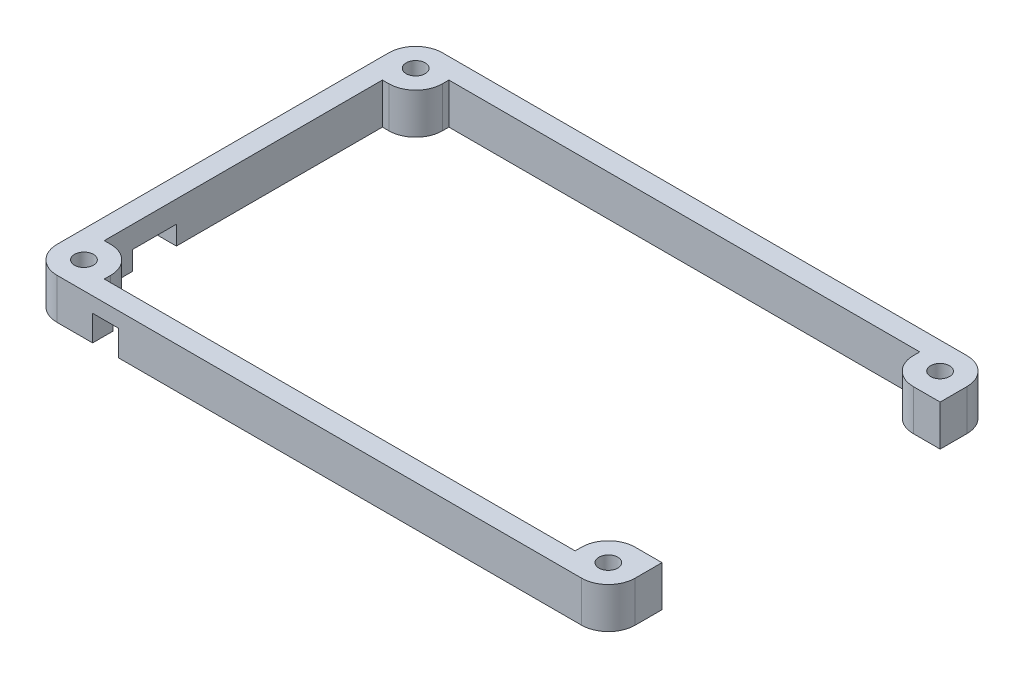
ISO-10303-21;
HEADER;
FILE_DESCRIPTION(('STEP AP214'),'2;1');
FILE_NAME('part.step','',(''),(''),'','','');
FILE_SCHEMA(('AUTOMOTIVE_DESIGN { 1 0 10303 214 1 1 1 1 }'));
ENDSEC;
DATA;
#1=APPLICATION_CONTEXT('core data for automotive mechanical design processes');
#2=APPLICATION_PROTOCOL_DEFINITION('international standard','automotive_design',2000,#1);
#3=PRODUCT_CONTEXT('',#1,'mechanical');
#4=PRODUCT('Part','Part','',(#3));
#5=PRODUCT_RELATED_PRODUCT_CATEGORY('part','',(#4));
#6=PRODUCT_DEFINITION_FORMATION('','',#4);
#7=PRODUCT_DEFINITION_CONTEXT('part definition',#1,'design');
#8=PRODUCT_DEFINITION('design','',#6,#7);
#9=PRODUCT_DEFINITION_SHAPE('','',#8);
#10=(LENGTH_UNIT() NAMED_UNIT(*) SI_UNIT(.MILLI.,.METRE.));
#11=(NAMED_UNIT(*) PLANE_ANGLE_UNIT() SI_UNIT($,.RADIAN.));
#12=(NAMED_UNIT(*) SI_UNIT($,.STERADIAN.) SOLID_ANGLE_UNIT());
#13=UNCERTAINTY_MEASURE_WITH_UNIT(LENGTH_MEASURE(1.E-05),#10,'distance_accuracy_value','');
#14=(GEOMETRIC_REPRESENTATION_CONTEXT(3) GLOBAL_UNCERTAINTY_ASSIGNED_CONTEXT((#13)) GLOBAL_UNIT_ASSIGNED_CONTEXT((#10,
#11,#12)) REPRESENTATION_CONTEXT('',''));
#15=CARTESIAN_POINT('',(0.,0.,0.));
#16=DIRECTION('',(0.,0.,1.));
#17=DIRECTION('',(1.,0.,0.));
#18=AXIS2_PLACEMENT_3D('',#15,#16,#17);
#19=CARTESIAN_POINT('',(-40.825,0.,-25.825));
#20=DIRECTION('',(0.,1.,0.));
#21=DIRECTION('',(0.,0.,1.));
#22=AXIS2_PLACEMENT_3D('',#19,#20,#21);
#23=PLANE('',#22);
#24=CARTESIAN_POINT('',(-40.825,0.,25.8135633602308));
#25=DIRECTION('',(0.,-1.,0.));
#26=DIRECTION('',(0.,0.,-1.));
#27=AXIS2_PLACEMENT_3D('',#24,#25,#26);
#28=CIRCLE('',#27,1.4732);
#29=CARTESIAN_POINT('',(-40.825,0.,24.3403633602308));
#30=VERTEX_POINT('',#29);
#31=EDGE_CURVE('E352',#30,#30,#28,.T.);
#32=ORIENTED_EDGE('',*,*,#31,.F.);
#33=EDGE_LOOP('',(#32));
#34=FACE_BOUND('',#33,.T.);
#35=DIRECTION('',(1.,0.,0.));
#36=VECTOR('',#35,1.);
#37=CARTESIAN_POINT('',(-36.65,0.,26.825));
#38=LINE('',#37,#36);
#39=CARTESIAN_POINT('',(-36.65,0.,26.825));
#40=VERTEX_POINT('',#39);
#41=CARTESIAN_POINT('',(-35.2866,0.,26.825));
#42=VERTEX_POINT('',#41);
#43=EDGE_CURVE('E261',#40,#42,#38,.T.);
#44=ORIENTED_EDGE('',*,*,#43,.T.);
#45=DIRECTION('',(0.,0.,1.));
#46=VECTOR('',#45,1.);
#47=CARTESIAN_POINT('',(-35.2866,0.,26.));
#48=LINE('',#47,#46);
#49=CARTESIAN_POINT('',(-35.2866,0.,30.));
#50=VERTEX_POINT('',#49);
#51=EDGE_CURVE('E244',#42,#50,#48,.T.);
#52=ORIENTED_EDGE('',*,*,#51,.T.);
#53=DIRECTION('',(1.,0.,0.));
#54=VECTOR('',#53,1.);
#55=CARTESIAN_POINT('',(-40.825,0.,30.));
#56=LINE('',#55,#54);
#57=CARTESIAN_POINT('',(-40.825,0.,30.));
#58=VERTEX_POINT('',#57);
#59=EDGE_CURVE('E258',#58,#50,#56,.T.);
#60=ORIENTED_EDGE('',*,*,#59,.F.);
#61=CARTESIAN_POINT('',(-40.825,0.,25.825));
#62=DIRECTION('',(0.,1.,0.));
#63=DIRECTION('',(0.,0.,1.));
#64=AXIS2_PLACEMENT_3D('',#61,#62,#63);
#65=CIRCLE('',#64,4.17500000000001);
#66=CARTESIAN_POINT('',(-45.,0.,25.825));
#67=VERTEX_POINT('',#66);
#68=EDGE_CURVE('E275',#67,#58,#65,.T.);
#69=ORIENTED_EDGE('',*,*,#68,.F.);
#70=DIRECTION('',(0.,0.,1.));
#71=VECTOR('',#70,1.);
#72=CARTESIAN_POINT('',(-45.,0.,-25.825));
#73=LINE('',#72,#71);
#74=CARTESIAN_POINT('',(-45.,0.,17.225));
#75=VERTEX_POINT('',#74);
#76=EDGE_CURVE('E506',#75,#67,#73,.T.);
#77=ORIENTED_EDGE('',*,*,#76,.F.);
#78=DIRECTION('',(1.,0.,0.));
#79=VECTOR('',#78,1.);
#80=CARTESIAN_POINT('',(-40.825,0.,17.225));
#81=LINE('',#80,#79);
#82=CARTESIAN_POINT('',(-41.825,0.,17.225));
#83=VERTEX_POINT('',#82);
#84=EDGE_CURVE('E382',#75,#83,#81,.T.);
#85=ORIENTED_EDGE('',*,*,#84,.T.);
#86=DIRECTION('',(0.,0.,1.));
#87=VECTOR('',#86,1.);
#88=CARTESIAN_POINT('',(-41.825,0.,-21.65));
#89=LINE('',#88,#87);
#90=CARTESIAN_POINT('',(-41.825,0.,21.65));
#91=VERTEX_POINT('',#90);
#92=EDGE_CURVE('E435',#83,#91,#89,.T.);
#93=ORIENTED_EDGE('',*,*,#92,.T.);
#94=DIRECTION('',(1.,0.,0.));
#95=VECTOR('',#94,1.);
#96=CARTESIAN_POINT('',(-40.825,0.,21.65));
#97=LINE('',#96,#95);
#98=CARTESIAN_POINT('',(-40.825,0.,21.65));
#99=VERTEX_POINT('',#98);
#100=EDGE_CURVE('E439',#91,#99,#97,.T.);
#101=ORIENTED_EDGE('',*,*,#100,.T.);
#102=CARTESIAN_POINT('',(-40.825,0.,25.825));
#103=DIRECTION('',(0.,-1.,0.));
#104=DIRECTION('',(0.,0.,1.));
#105=AXIS2_PLACEMENT_3D('',#102,#103,#104);
#106=CIRCLE('',#105,4.17499999999999);
#107=CARTESIAN_POINT('',(-36.65,0.,25.825));
#108=VERTEX_POINT('',#107);
#109=EDGE_CURVE('E442',#99,#108,#106,.T.);
#110=ORIENTED_EDGE('',*,*,#109,.T.);
#111=DIRECTION('',(0.,0.,1.));
#112=VECTOR('',#111,1.);
#113=CARTESIAN_POINT('',(-36.65,0.,25.825));
#114=LINE('',#113,#112);
#115=EDGE_CURVE('E445',#108,#40,#114,.T.);
#116=ORIENTED_EDGE('',*,*,#115,.T.);
#117=EDGE_LOOP('',(#44,#52,#60,#69,#77,#85,#93,#101,#110,#116));
#118=FACE_BOUND('',#117,.T.);
#119=ADVANCED_FACE('F34',(#34,#118),#23,.F.);
#120=CARTESIAN_POINT('',(-40.825,0.,-25.825));
#121=DIRECTION('',(0.,-1.,0.));
#122=DIRECTION('',(0.,0.,-1.));
#123=AXIS2_PLACEMENT_3D('',#120,#121,#122);
#124=CIRCLE('',#123,1.475);
#125=CARTESIAN_POINT('',(-40.825,0.,-27.3));
#126=VERTEX_POINT('',#125);
#127=EDGE_CURVE('E358',#126,#126,#124,.T.);
#128=ORIENTED_EDGE('',*,*,#127,.F.);
#129=EDGE_LOOP('',(#128));
#130=FACE_BOUND('',#129,.T.);
#131=CARTESIAN_POINT('',(40.825,0.,-25.8148796301043));
#132=DIRECTION('',(0.,-1.,0.));
#133=DIRECTION('',(0.,0.,-1.));
#134=AXIS2_PLACEMENT_3D('',#131,#132,#133);
#135=CIRCLE('',#134,1.4732);
#136=CARTESIAN_POINT('',(40.825,0.,-27.2880796301043));
#137=VERTEX_POINT('',#136);
#138=EDGE_CURVE('E337',#137,#137,#135,.T.);
#139=ORIENTED_EDGE('',*,*,#138,.F.);
#140=EDGE_LOOP('',(#139));
#141=FACE_BOUND('',#140,.T.);
#142=DIRECTION('',(0.,0.,-1.));
#143=VECTOR('',#142,1.);
#144=CARTESIAN_POINT('',(45.,0.,-25.825));
#145=LINE('',#144,#143);
#146=CARTESIAN_POINT('',(45.,0.,-21.65));
#147=VERTEX_POINT('',#146);
#148=CARTESIAN_POINT('',(45.,0.,-25.825));
#149=VERTEX_POINT('',#148);
#150=EDGE_CURVE('E273',#147,#149,#145,.T.);
#151=ORIENTED_EDGE('',*,*,#150,.F.);
#152=DIRECTION('',(-1.,0.,0.));
#153=VECTOR('',#152,1.);
#154=CARTESIAN_POINT('',(40.825,0.,-21.65));
#155=LINE('',#154,#153);
#156=CARTESIAN_POINT('',(40.825,0.,-21.65));
#157=VERTEX_POINT('',#156);
#158=EDGE_CURVE('E389',#147,#157,#155,.T.);
#159=ORIENTED_EDGE('',*,*,#158,.T.);
#160=CARTESIAN_POINT('',(40.825,0.,-25.825));
#161=DIRECTION('',(0.,-1.,0.));
#162=DIRECTION('',(0.,0.,1.));
#163=AXIS2_PLACEMENT_3D('',#160,#161,#162);
#164=CIRCLE('',#163,4.175);
#165=CARTESIAN_POINT('',(36.65,0.,-25.825));
#166=VERTEX_POINT('',#165);
#167=EDGE_CURVE('E385',#157,#166,#164,.T.);
#168=ORIENTED_EDGE('',*,*,#167,.T.);
#169=DIRECTION('',(0.,0.,-1.));
#170=VECTOR('',#169,1.);
#171=CARTESIAN_POINT('',(36.65,0.,-25.825));
#172=LINE('',#171,#170);
#173=CARTESIAN_POINT('',(36.65,0.,-26.825));
#174=VERTEX_POINT('',#173);
#175=EDGE_CURVE('E420',#166,#174,#172,.T.);
#176=ORIENTED_EDGE('',*,*,#175,.T.);
#177=DIRECTION('',(-1.,0.,0.));
#178=VECTOR('',#177,1.);
#179=CARTESIAN_POINT('',(-36.65,0.,-26.825));
#180=LINE('',#179,#178);
#181=CARTESIAN_POINT('',(-36.65,0.,-26.825));
#182=VERTEX_POINT('',#181);
#183=EDGE_CURVE('E423',#174,#182,#180,.T.);
#184=ORIENTED_EDGE('',*,*,#183,.T.);
#185=DIRECTION('',(0.,0.,1.));
#186=VECTOR('',#185,1.);
#187=CARTESIAN_POINT('',(-36.65,0.,-25.825));
#188=LINE('',#187,#186);
#189=CARTESIAN_POINT('',(-36.65,0.,-25.825));
#190=VERTEX_POINT('',#189);
#191=EDGE_CURVE('E426',#182,#190,#188,.T.);
#192=ORIENTED_EDGE('',*,*,#191,.T.);
#193=CARTESIAN_POINT('',(-40.825,0.,-25.825));
#194=DIRECTION('',(0.,-1.,0.));
#195=DIRECTION('',(0.,0.,1.));
#196=AXIS2_PLACEMENT_3D('',#193,#194,#195);
#197=CIRCLE('',#196,4.175);
#198=CARTESIAN_POINT('',(-40.825,0.,-21.65));
#199=VERTEX_POINT('',#198);
#200=EDGE_CURVE('E429',#190,#199,#197,.T.);
#201=ORIENTED_EDGE('',*,*,#200,.T.);
#202=DIRECTION('',(-1.,0.,0.));
#203=VECTOR('',#202,1.);
#204=CARTESIAN_POINT('',(-40.825,0.,-21.65));
#205=LINE('',#204,#203);
#206=CARTESIAN_POINT('',(-41.825,0.,-21.65));
#207=VERTEX_POINT('',#206);
#208=EDGE_CURVE('E432',#199,#207,#205,.T.);
#209=ORIENTED_EDGE('',*,*,#208,.T.);
#210=CARTESIAN_POINT('',(-41.825,0.,10.425));
#211=VERTEX_POINT('',#210);
#212=EDGE_CURVE('E436',#207,#211,#89,.T.);
#213=ORIENTED_EDGE('',*,*,#212,.T.);
#214=DIRECTION('',(-1.,0.,0.));
#215=VECTOR('',#214,1.);
#216=CARTESIAN_POINT('',(-40.825,0.,10.425));
#217=LINE('',#216,#215);
#218=CARTESIAN_POINT('',(-45.,0.,10.425));
#219=VERTEX_POINT('',#218);
#220=EDGE_CURVE('E57',#211,#219,#217,.T.);
#221=ORIENTED_EDGE('',*,*,#220,.T.);
#222=CARTESIAN_POINT('',(-45.,0.,-25.825));
#223=VERTEX_POINT('',#222);
#224=EDGE_CURVE('E507',#223,#219,#73,.T.);
#225=ORIENTED_EDGE('',*,*,#224,.F.);
#226=CARTESIAN_POINT('',(-40.825,0.,-25.825));
#227=DIRECTION('',(0.,1.,0.));
#228=DIRECTION('',(0.,0.,1.));
#229=AXIS2_PLACEMENT_3D('',#226,#227,#228);
#230=CIRCLE('',#229,4.17499999999999);
#231=CARTESIAN_POINT('',(-40.825,0.,-30.));
#232=VERTEX_POINT('',#231);
#233=EDGE_CURVE('E487',#232,#223,#230,.T.);
#234=ORIENTED_EDGE('',*,*,#233,.F.);
#235=DIRECTION('',(-1.,0.,0.));
#236=VECTOR('',#235,1.);
#237=CARTESIAN_POINT('',(-40.825,0.,-30.));
#238=LINE('',#237,#236);
#239=CARTESIAN_POINT('',(40.825,0.,-30.));
#240=VERTEX_POINT('',#239);
#241=EDGE_CURVE('E284',#240,#232,#238,.T.);
#242=ORIENTED_EDGE('',*,*,#241,.F.);
#243=CARTESIAN_POINT('',(40.825,0.,-25.825));
#244=DIRECTION('',(0.,1.,0.));
#245=DIRECTION('',(0.,0.,1.));
#246=AXIS2_PLACEMENT_3D('',#243,#244,#245);
#247=CIRCLE('',#246,4.175);
#248=EDGE_CURVE('E282',#149,#240,#247,.T.);
#249=ORIENTED_EDGE('',*,*,#248,.F.);
#250=EDGE_LOOP('',(#151,#159,#168,#176,#184,#192,#201,#209,#213,#221,#225,#234,#242,#249));
#251=FACE_BOUND('',#250,.T.);
#252=ADVANCED_FACE('F531',(#130,#141,#251),#23,.F.);
#253=CARTESIAN_POINT('',(45.,6.35,-25.825));
#254=DIRECTION('',(-1.,0.,0.));
#255=DIRECTION('',(0.,0.,1.));
#256=AXIS2_PLACEMENT_3D('',#253,#254,#255);
#257=PLANE('',#256);
#258=DIRECTION('',(0.,0.,-1.));
#259=VECTOR('',#258,1.);
#260=CARTESIAN_POINT('',(45.,6.35,-25.825));
#261=LINE('',#260,#259);
#262=CARTESIAN_POINT('',(45.,6.35,-21.65));
#263=VERTEX_POINT('',#262);
#264=CARTESIAN_POINT('',(45.,6.35,-25.825));
#265=VERTEX_POINT('',#264);
#266=EDGE_CURVE('E498',#263,#265,#261,.T.);
#267=ORIENTED_EDGE('',*,*,#266,.F.);
#268=DIRECTION('',(0.,1.,0.));
#269=VECTOR('',#268,1.);
#270=CARTESIAN_POINT('',(45.,-3.65,-21.65));
#271=LINE('',#270,#269);
#272=EDGE_CURVE('E334',#147,#263,#271,.T.);
#273=ORIENTED_EDGE('',*,*,#272,.F.);
#274=ORIENTED_EDGE('',*,*,#150,.T.);
#275=DIRECTION('',(0.,-1.,0.));
#276=VECTOR('',#275,1.);
#277=CARTESIAN_POINT('',(45.,6.35,-25.825));
#278=LINE('',#277,#276);
#279=EDGE_CURVE('E294',#265,#149,#278,.T.);
#280=ORIENTED_EDGE('',*,*,#279,.F.);
#281=EDGE_LOOP('',(#267,#273,#274,#280));
#282=FACE_BOUND('',#281,.T.);
#283=ADVANCED_FACE('F599',(#282),#257,.F.);
#284=CARTESIAN_POINT('',(-40.825,6.35,-25.825));
#285=DIRECTION('',(0.,1.,0.));
#286=DIRECTION('',(0.,0.,1.));
#287=AXIS2_PLACEMENT_3D('',#284,#285,#286);
#288=PLANE('',#287);
#289=DIRECTION('',(-1.,0.,0.));
#290=VECTOR('',#289,1.);
#291=CARTESIAN_POINT('',(40.825,6.35,-21.65));
#292=LINE('',#291,#290);
#293=CARTESIAN_POINT('',(40.825,6.35,-21.65));
#294=VERTEX_POINT('',#293);
#295=EDGE_CURVE('E415',#263,#294,#292,.T.);
#296=ORIENTED_EDGE('',*,*,#295,.F.);
#297=ORIENTED_EDGE('',*,*,#266,.T.);
#298=CARTESIAN_POINT('',(40.825,6.35,-25.825));
#299=DIRECTION('',(0.,1.,0.));
#300=DIRECTION('',(0.,0.,1.));
#301=AXIS2_PLACEMENT_3D('',#298,#299,#300);
#302=CIRCLE('',#301,4.175);
#303=CARTESIAN_POINT('',(40.825,6.35,-30.));
#304=VERTEX_POINT('',#303);
#305=EDGE_CURVE('E502',#265,#304,#302,.T.);
#306=ORIENTED_EDGE('',*,*,#305,.T.);
#307=DIRECTION('',(-1.,0.,0.));
#308=VECTOR('',#307,1.);
#309=CARTESIAN_POINT('',(-40.825,6.35,-30.));
#310=LINE('',#309,#308);
#311=CARTESIAN_POINT('',(-40.825,6.35,-30.));
#312=VERTEX_POINT('',#311);
#313=EDGE_CURVE('E291',#304,#312,#310,.T.);
#314=ORIENTED_EDGE('',*,*,#313,.T.);
#315=CARTESIAN_POINT('',(-40.825,6.35,-25.825));
#316=DIRECTION('',(0.,1.,0.));
#317=DIRECTION('',(0.,0.,1.));
#318=AXIS2_PLACEMENT_3D('',#315,#316,#317);
#319=CIRCLE('',#318,4.17499999999999);
#320=CARTESIAN_POINT('',(-45.,6.35,-25.825));
#321=VERTEX_POINT('',#320);
#322=EDGE_CURVE('E286',#312,#321,#319,.T.);
#323=ORIENTED_EDGE('',*,*,#322,.T.);
#324=DIRECTION('',(0.,0.,1.));
#325=VECTOR('',#324,1.);
#326=CARTESIAN_POINT('',(-45.,6.35,-25.825));
#327=LINE('',#326,#325);
#328=CARTESIAN_POINT('',(-45.,6.35,25.825));
#329=VERTEX_POINT('',#328);
#330=EDGE_CURVE('E490',#321,#329,#327,.T.);
#331=ORIENTED_EDGE('',*,*,#330,.T.);
#332=CARTESIAN_POINT('',(-40.825,6.35,25.825));
#333=DIRECTION('',(0.,1.,0.));
#334=DIRECTION('',(0.,0.,1.));
#335=AXIS2_PLACEMENT_3D('',#332,#333,#334);
#336=CIRCLE('',#335,4.17500000000001);
#337=CARTESIAN_POINT('',(-40.825,6.35,30.));
#338=VERTEX_POINT('',#337);
#339=EDGE_CURVE('E492',#329,#338,#336,.T.);
#340=ORIENTED_EDGE('',*,*,#339,.T.);
#341=DIRECTION('',(1.,0.,0.));
#342=VECTOR('',#341,1.);
#343=CARTESIAN_POINT('',(-40.825,6.35,30.));
#344=LINE('',#343,#342);
#345=CARTESIAN_POINT('',(40.825,6.35,30.));
#346=VERTEX_POINT('',#345);
#347=EDGE_CURVE('E494',#338,#346,#344,.T.);
#348=ORIENTED_EDGE('',*,*,#347,.T.);
#349=CARTESIAN_POINT('',(40.825,6.35,25.825));
#350=DIRECTION('',(0.,1.,0.));
#351=DIRECTION('',(0.,0.,1.));
#352=AXIS2_PLACEMENT_3D('',#349,#350,#351);
#353=CIRCLE('',#352,4.17499999999999);
#354=CARTESIAN_POINT('',(45.,6.35,25.825));
#355=VERTEX_POINT('',#354);
#356=EDGE_CURVE('E496',#346,#355,#353,.T.);
#357=ORIENTED_EDGE('',*,*,#356,.T.);
#358=CARTESIAN_POINT('',(45.,6.35,21.65));
#359=VERTEX_POINT('',#358);
#360=EDGE_CURVE('E499',#355,#359,#261,.T.);
#361=ORIENTED_EDGE('',*,*,#360,.T.);
#362=DIRECTION('',(1.,0.,0.));
#363=VECTOR('',#362,1.);
#364=CARTESIAN_POINT('',(40.825,6.35,21.65));
#365=LINE('',#364,#363);
#366=CARTESIAN_POINT('',(40.825,6.35,21.65));
#367=VERTEX_POINT('',#366);
#368=EDGE_CURVE('E413',#367,#359,#365,.T.);
#369=ORIENTED_EDGE('',*,*,#368,.F.);
#370=CARTESIAN_POINT('',(40.825,6.35,25.825));
#371=DIRECTION('',(0.,-1.,0.));
#372=DIRECTION('',(0.,0.,1.));
#373=AXIS2_PLACEMENT_3D('',#370,#371,#372);
#374=CIRCLE('',#373,4.175);
#375=CARTESIAN_POINT('',(36.65,6.35,25.825));
#376=VERTEX_POINT('',#375);
#377=EDGE_CURVE('E411',#376,#367,#374,.T.);
#378=ORIENTED_EDGE('',*,*,#377,.F.);
#379=DIRECTION('',(0.,0.,-1.));
#380=VECTOR('',#379,1.);
#381=CARTESIAN_POINT('',(36.65,6.35,25.825));
#382=LINE('',#381,#380);
#383=CARTESIAN_POINT('',(36.65,6.35,26.825));
#384=VERTEX_POINT('',#383);
#385=EDGE_CURVE('E409',#384,#376,#382,.T.);
#386=ORIENTED_EDGE('',*,*,#385,.F.);
#387=DIRECTION('',(1.,0.,0.));
#388=VECTOR('',#387,1.);
#389=CARTESIAN_POINT('',(-36.65,6.35,26.825));
#390=LINE('',#389,#388);
#391=CARTESIAN_POINT('',(-36.65,6.35,26.825));
#392=VERTEX_POINT('',#391);
#393=EDGE_CURVE('E407',#392,#384,#390,.T.);
#394=ORIENTED_EDGE('',*,*,#393,.F.);
#395=DIRECTION('',(0.,0.,1.));
#396=VECTOR('',#395,1.);
#397=CARTESIAN_POINT('',(-36.65,6.35,25.825));
#398=LINE('',#397,#396);
#399=CARTESIAN_POINT('',(-36.65,6.35,25.825));
#400=VERTEX_POINT('',#399);
#401=EDGE_CURVE('E405',#400,#392,#398,.T.);
#402=ORIENTED_EDGE('',*,*,#401,.F.);
#403=CARTESIAN_POINT('',(-40.825,6.35,25.825));
#404=DIRECTION('',(0.,-1.,0.));
#405=DIRECTION('',(0.,0.,1.));
#406=AXIS2_PLACEMENT_3D('',#403,#404,#405);
#407=CIRCLE('',#406,4.17499999999999);
#408=CARTESIAN_POINT('',(-40.825,6.35,21.65));
#409=VERTEX_POINT('',#408);
#410=EDGE_CURVE('E403',#409,#400,#407,.T.);
#411=ORIENTED_EDGE('',*,*,#410,.F.);
#412=DIRECTION('',(1.,0.,0.));
#413=VECTOR('',#412,1.);
#414=CARTESIAN_POINT('',(-40.825,6.35,21.65));
#415=LINE('',#414,#413);
#416=CARTESIAN_POINT('',(-41.825,6.35,21.65));
#417=VERTEX_POINT('',#416);
#418=EDGE_CURVE('E401',#417,#409,#415,.T.);
#419=ORIENTED_EDGE('',*,*,#418,.F.);
#420=DIRECTION('',(0.,0.,1.));
#421=VECTOR('',#420,1.);
#422=CARTESIAN_POINT('',(-41.825,6.35,-21.65));
#423=LINE('',#422,#421);
#424=CARTESIAN_POINT('',(-41.825,6.35,-21.65));
#425=VERTEX_POINT('',#424);
#426=EDGE_CURVE('E399',#425,#417,#423,.T.);
#427=ORIENTED_EDGE('',*,*,#426,.F.);
#428=DIRECTION('',(-1.,0.,0.));
#429=VECTOR('',#428,1.);
#430=CARTESIAN_POINT('',(-40.825,6.35,-21.65));
#431=LINE('',#430,#429);
#432=CARTESIAN_POINT('',(-40.825,6.35,-21.65));
#433=VERTEX_POINT('',#432);
#434=EDGE_CURVE('E397',#433,#425,#431,.T.);
#435=ORIENTED_EDGE('',*,*,#434,.F.);
#436=CARTESIAN_POINT('',(-40.825,6.35,-25.825));
#437=DIRECTION('',(0.,-1.,0.));
#438=DIRECTION('',(0.,0.,1.));
#439=AXIS2_PLACEMENT_3D('',#436,#437,#438);
#440=CIRCLE('',#439,4.175);
#441=CARTESIAN_POINT('',(-36.65,6.35,-25.825));
#442=VERTEX_POINT('',#441);
#443=EDGE_CURVE('E395',#442,#433,#440,.T.);
#444=ORIENTED_EDGE('',*,*,#443,.F.);
#445=DIRECTION('',(0.,0.,1.));
#446=VECTOR('',#445,1.);
#447=CARTESIAN_POINT('',(-36.65,6.35,-25.825));
#448=LINE('',#447,#446);
#449=CARTESIAN_POINT('',(-36.65,6.35,-26.825));
#450=VERTEX_POINT('',#449);
#451=EDGE_CURVE('E393',#450,#442,#448,.T.);
#452=ORIENTED_EDGE('',*,*,#451,.F.);
#453=DIRECTION('',(-1.,0.,0.));
#454=VECTOR('',#453,1.);
#455=CARTESIAN_POINT('',(-36.65,6.35,-26.825));
#456=LINE('',#455,#454);
#457=CARTESIAN_POINT('',(36.65,6.35,-26.825));
#458=VERTEX_POINT('',#457);
#459=EDGE_CURVE('E391',#458,#450,#456,.T.);
#460=ORIENTED_EDGE('',*,*,#459,.F.);
#461=DIRECTION('',(0.,0.,-1.));
#462=VECTOR('',#461,1.);
#463=CARTESIAN_POINT('',(36.65,6.35,-25.825));
#464=LINE('',#463,#462);
#465=CARTESIAN_POINT('',(36.65,6.35,-25.825));
#466=VERTEX_POINT('',#465);
#467=EDGE_CURVE('E388',#466,#458,#464,.T.);
#468=ORIENTED_EDGE('',*,*,#467,.F.);
#469=CARTESIAN_POINT('',(40.825,6.35,-25.825));
#470=DIRECTION('',(0.,-1.,0.));
#471=DIRECTION('',(0.,0.,1.));
#472=AXIS2_PLACEMENT_3D('',#469,#470,#471);
#473=CIRCLE('',#472,4.175);
#474=EDGE_CURVE('E386',#294,#466,#473,.T.);
#475=ORIENTED_EDGE('',*,*,#474,.F.);
#476=EDGE_LOOP('',(#296,#297,#306,#314,#323,#331,#340,#348,#357,#361,#369,#378,#386,#394,#402,
#411,#419,#427,#435,#444,#452,#460,#468,#475));
#477=FACE_BOUND('',#476,.T.);
#478=CARTESIAN_POINT('',(40.825,6.35,-25.8148796301043));
#479=DIRECTION('',(0.,1.,0.));
#480=DIRECTION('',(0.,0.,1.));
#481=AXIS2_PLACEMENT_3D('',#478,#479,#480);
#482=CIRCLE('',#481,1.4732);
#483=CARTESIAN_POINT('',(40.825,6.35,-24.3416796301043));
#484=VERTEX_POINT('',#483);
#485=EDGE_CURVE('E343',#484,#484,#482,.F.);
#486=ORIENTED_EDGE('',*,*,#485,.T.);
#487=EDGE_LOOP('',(#486));
#488=FACE_BOUND('',#487,.T.);
#489=CARTESIAN_POINT('',(40.825,6.35,25.825));
#490=DIRECTION('',(0.,1.,0.));
#491=DIRECTION('',(0.,0.,1.));
#492=AXIS2_PLACEMENT_3D('',#489,#490,#491);
#493=CIRCLE('',#492,1.4732);
#494=CARTESIAN_POINT('',(40.825,6.35,27.2982));
#495=VERTEX_POINT('',#494);
#496=EDGE_CURVE('E349',#495,#495,#493,.F.);
#497=ORIENTED_EDGE('',*,*,#496,.T.);
#498=EDGE_LOOP('',(#497));
#499=FACE_BOUND('',#498,.T.);
#500=CARTESIAN_POINT('',(-40.825,6.35,25.8135633602308));
#501=DIRECTION('',(0.,1.,0.));
#502=DIRECTION('',(0.,0.,1.));
#503=AXIS2_PLACEMENT_3D('',#500,#501,#502);
#504=CIRCLE('',#503,1.4732);
#505=CARTESIAN_POINT('',(-40.825,6.35,27.2867633602308));
#506=VERTEX_POINT('',#505);
#507=EDGE_CURVE('E355',#506,#506,#504,.F.);
#508=ORIENTED_EDGE('',*,*,#507,.T.);
#509=EDGE_LOOP('',(#508));
#510=FACE_BOUND('',#509,.T.);
#511=CARTESIAN_POINT('',(-40.825,6.35,-25.825));
#512=DIRECTION('',(0.,1.,0.));
#513=DIRECTION('',(0.,0.,1.));
#514=AXIS2_PLACEMENT_3D('',#511,#512,#513);
#515=CIRCLE('',#514,1.475);
#516=CARTESIAN_POINT('',(-40.825,6.35,-24.35));
#517=VERTEX_POINT('',#516);
#518=EDGE_CURVE('E361',#517,#517,#515,.F.);
#519=ORIENTED_EDGE('',*,*,#518,.T.);
#520=EDGE_LOOP('',(#519));
#521=FACE_BOUND('',#520,.T.);
#522=ADVANCED_FACE('F520',(#477,#488,#499,#510,#521),#288,.T.);
#523=CARTESIAN_POINT('',(40.825,0.,25.825));
#524=DIRECTION('',(0.,-1.,0.));
#525=DIRECTION('',(0.,0.,-1.));
#526=AXIS2_PLACEMENT_3D('',#523,#524,#525);
#527=CIRCLE('',#526,1.4732);
#528=CARTESIAN_POINT('',(40.825,0.,24.3518));
#529=VERTEX_POINT('',#528);
#530=EDGE_CURVE('E346',#529,#529,#527,.T.);
#531=ORIENTED_EDGE('',*,*,#530,.F.);
#532=EDGE_LOOP('',(#531));
#533=FACE_BOUND('',#532,.T.);
#534=CARTESIAN_POINT('',(-31.2866,0.,30.));
#535=VERTEX_POINT('',#534);
#536=CARTESIAN_POINT('',(40.825,0.,30.));
#537=VERTEX_POINT('',#536);
#538=EDGE_CURVE('E271',#535,#537,#56,.T.);
#539=ORIENTED_EDGE('',*,*,#538,.F.);
#540=DIRECTION('',(0.,0.,1.));
#541=VECTOR('',#540,1.);
#542=CARTESIAN_POINT('',(-31.2866,0.,26.));
#543=LINE('',#542,#541);
#544=CARTESIAN_POINT('',(-31.2866,0.,26.825));
#545=VERTEX_POINT('',#544);
#546=EDGE_CURVE('E262',#545,#535,#543,.T.);
#547=ORIENTED_EDGE('',*,*,#546,.F.);
#548=CARTESIAN_POINT('',(36.65,0.,26.825));
#549=VERTEX_POINT('',#548);
#550=EDGE_CURVE('E321',#545,#549,#38,.T.);
#551=ORIENTED_EDGE('',*,*,#550,.T.);
#552=DIRECTION('',(0.,0.,-1.));
#553=VECTOR('',#552,1.);
#554=CARTESIAN_POINT('',(36.65,0.,25.825));
#555=LINE('',#554,#553);
#556=CARTESIAN_POINT('',(36.65,0.,25.825));
#557=VERTEX_POINT('',#556);
#558=EDGE_CURVE('E448',#549,#557,#555,.T.);
#559=ORIENTED_EDGE('',*,*,#558,.T.);
#560=CARTESIAN_POINT('',(40.825,0.,25.825));
#561=DIRECTION('',(0.,-1.,0.));
#562=DIRECTION('',(0.,0.,1.));
#563=AXIS2_PLACEMENT_3D('',#560,#561,#562);
#564=CIRCLE('',#563,4.175);
#565=CARTESIAN_POINT('',(40.825,0.,21.65));
#566=VERTEX_POINT('',#565);
#567=EDGE_CURVE('E450',#557,#566,#564,.T.);
#568=ORIENTED_EDGE('',*,*,#567,.T.);
#569=DIRECTION('',(1.,0.,0.));
#570=VECTOR('',#569,1.);
#571=CARTESIAN_POINT('',(40.825,0.,21.65));
#572=LINE('',#571,#570);
#573=CARTESIAN_POINT('',(45.,0.,21.65));
#574=VERTEX_POINT('',#573);
#575=EDGE_CURVE('E453',#566,#574,#572,.T.);
#576=ORIENTED_EDGE('',*,*,#575,.T.);
#577=CARTESIAN_POINT('',(45.,0.,25.825));
#578=VERTEX_POINT('',#577);
#579=EDGE_CURVE('E279',#578,#574,#145,.T.);
#580=ORIENTED_EDGE('',*,*,#579,.F.);
#581=CARTESIAN_POINT('',(40.825,0.,25.825));
#582=DIRECTION('',(0.,1.,0.));
#583=DIRECTION('',(0.,0.,1.));
#584=AXIS2_PLACEMENT_3D('',#581,#582,#583);
#585=CIRCLE('',#584,4.17499999999999);
#586=EDGE_CURVE('E270',#537,#578,#585,.T.);
#587=ORIENTED_EDGE('',*,*,#586,.F.);
#588=EDGE_LOOP('',(#539,#547,#551,#559,#568,#576,#580,#587));
#589=FACE_BOUND('',#588,.T.);
#590=ADVANCED_FACE('F327',(#533,#589),#23,.F.);
#591=CARTESIAN_POINT('',(-40.825,6.35,-25.825));
#592=DIRECTION('',(0.,-1.,0.));
#593=DIRECTION('',(0.,0.,-1.));
#594=AXIS2_PLACEMENT_3D('',#591,#592,#593);
#595=CYLINDRICAL_SURFACE('',#594,4.17499999999999);
#596=ORIENTED_EDGE('',*,*,#233,.T.);
#597=DIRECTION('',(0.,-1.,0.));
#598=VECTOR('',#597,1.);
#599=CARTESIAN_POINT('',(-45.,6.35,-25.825));
#600=LINE('',#599,#598);
#601=EDGE_CURVE('E307',#321,#223,#600,.T.);
#602=ORIENTED_EDGE('',*,*,#601,.F.);
#603=ORIENTED_EDGE('',*,*,#322,.F.);
#604=DIRECTION('',(0.,-1.,0.));
#605=VECTOR('',#604,1.);
#606=CARTESIAN_POINT('',(-40.825,6.35,-30.));
#607=LINE('',#606,#605);
#608=EDGE_CURVE('E287',#312,#232,#607,.T.);
#609=ORIENTED_EDGE('',*,*,#608,.T.);
#610=EDGE_LOOP('',(#596,#602,#603,#609));
#611=FACE_BOUND('',#610,.T.);
#612=ADVANCED_FACE('F36',(#611),#595,.T.);
#613=CARTESIAN_POINT('',(-45.,6.35,-25.825));
#614=DIRECTION('',(1.,0.,0.));
#615=DIRECTION('',(0.,0.,-1.));
#616=AXIS2_PLACEMENT_3D('',#613,#614,#615);
#617=PLANE('',#616);
#618=DIRECTION('',(0.,0.,-1.));
#619=VECTOR('',#618,1.);
#620=CARTESIAN_POINT('',(-45.,2.95,17.225));
#621=LINE('',#620,#619);
#622=CARTESIAN_POINT('',(-45.,2.95,17.225));
#623=VERTEX_POINT('',#622);
#624=CARTESIAN_POINT('',(-45.,2.95,10.425));
#625=VERTEX_POINT('',#624);
#626=EDGE_CURVE('E365',#623,#625,#621,.T.);
#627=ORIENTED_EDGE('',*,*,#626,.F.);
#628=DIRECTION('',(0.,1.,0.));
#629=VECTOR('',#628,1.);
#630=CARTESIAN_POINT('',(-45.,2.95,17.225));
#631=LINE('',#630,#629);
#632=EDGE_CURVE('E369',#75,#623,#631,.T.);
#633=ORIENTED_EDGE('',*,*,#632,.F.);
#634=ORIENTED_EDGE('',*,*,#76,.T.);
#635=DIRECTION('',(0.,-1.,0.));
#636=VECTOR('',#635,1.);
#637=CARTESIAN_POINT('',(-45.,6.35,25.825));
#638=LINE('',#637,#636);
#639=EDGE_CURVE('E304',#329,#67,#638,.T.);
#640=ORIENTED_EDGE('',*,*,#639,.F.);
#641=ORIENTED_EDGE('',*,*,#330,.F.);
#642=ORIENTED_EDGE('',*,*,#601,.T.);
#643=ORIENTED_EDGE('',*,*,#224,.T.);
#644=DIRECTION('',(0.,-1.,0.));
#645=VECTOR('',#644,1.);
#646=CARTESIAN_POINT('',(-45.,2.95,10.425));
#647=LINE('',#646,#645);
#648=EDGE_CURVE('E364',#625,#219,#647,.T.);
#649=ORIENTED_EDGE('',*,*,#648,.F.);
#650=EDGE_LOOP('',(#627,#633,#634,#640,#641,#642,#643,#649));
#651=FACE_BOUND('',#650,.T.);
#652=ADVANCED_FACE('F515',(#651),#617,.F.);
#653=CARTESIAN_POINT('',(-40.825,6.35,25.825));
#654=DIRECTION('',(0.,-1.,0.));
#655=DIRECTION('',(0.,0.,-1.));
#656=AXIS2_PLACEMENT_3D('',#653,#654,#655);
#657=CYLINDRICAL_SURFACE('',#656,4.17500000000001);
#658=ORIENTED_EDGE('',*,*,#68,.T.);
#659=DIRECTION('',(0.,-1.,0.));
#660=VECTOR('',#659,1.);
#661=CARTESIAN_POINT('',(-40.825,6.35,30.));
#662=LINE('',#661,#660);
#663=EDGE_CURVE('E269',#338,#58,#662,.T.);
#664=ORIENTED_EDGE('',*,*,#663,.F.);
#665=ORIENTED_EDGE('',*,*,#339,.F.);
#666=ORIENTED_EDGE('',*,*,#639,.T.);
#667=EDGE_LOOP('',(#658,#664,#665,#666));
#668=FACE_BOUND('',#667,.T.);
#669=ADVANCED_FACE('F518',(#668),#657,.T.);
#670=CARTESIAN_POINT('',(-40.825,6.35,30.));
#671=DIRECTION('',(0.,0.,-1.));
#672=DIRECTION('',(-1.,0.,0.));
#673=AXIS2_PLACEMENT_3D('',#670,#671,#672);
#674=PLANE('',#673);
#675=ORIENTED_EDGE('',*,*,#59,.T.);
#676=DIRECTION('',(0.,-1.,0.));
#677=VECTOR('',#676,1.);
#678=CARTESIAN_POINT('',(-35.2866,4.,30.));
#679=LINE('',#678,#677);
#680=CARTESIAN_POINT('',(-35.2866,4.,30.));
#681=VERTEX_POINT('',#680);
#682=EDGE_CURVE('E241',#681,#50,#679,.T.);
#683=ORIENTED_EDGE('',*,*,#682,.F.);
#684=DIRECTION('',(-1.,0.,0.));
#685=VECTOR('',#684,1.);
#686=CARTESIAN_POINT('',(-31.2866,4.,30.));
#687=LINE('',#686,#685);
#688=CARTESIAN_POINT('',(-31.2866,4.,30.));
#689=VERTEX_POINT('',#688);
#690=EDGE_CURVE('E263',#689,#681,#687,.T.);
#691=ORIENTED_EDGE('',*,*,#690,.F.);
#692=DIRECTION('',(0.,1.,0.));
#693=VECTOR('',#692,1.);
#694=CARTESIAN_POINT('',(-31.2866,4.,30.));
#695=LINE('',#694,#693);
#696=EDGE_CURVE('E252',#535,#689,#695,.T.);
#697=ORIENTED_EDGE('',*,*,#696,.F.);
#698=ORIENTED_EDGE('',*,*,#538,.T.);
#699=DIRECTION('',(0.,-1.,0.));
#700=VECTOR('',#699,1.);
#701=CARTESIAN_POINT('',(40.825,6.35,30.));
#702=LINE('',#701,#700);
#703=EDGE_CURVE('E300',#346,#537,#702,.T.);
#704=ORIENTED_EDGE('',*,*,#703,.F.);
#705=ORIENTED_EDGE('',*,*,#347,.F.);
#706=ORIENTED_EDGE('',*,*,#663,.T.);
#707=EDGE_LOOP('',(#675,#683,#691,#697,#698,#704,#705,#706));
#708=FACE_BOUND('',#707,.T.);
#709=ADVANCED_FACE('F266',(#708),#674,.F.);
#710=CARTESIAN_POINT('',(40.825,6.35,25.825));
#711=DIRECTION('',(0.,-1.,0.));
#712=DIRECTION('',(0.,0.,-1.));
#713=AXIS2_PLACEMENT_3D('',#710,#711,#712);
#714=CYLINDRICAL_SURFACE('',#713,4.17499999999999);
#715=ORIENTED_EDGE('',*,*,#586,.T.);
#716=DIRECTION('',(0.,-1.,0.));
#717=VECTOR('',#716,1.);
#718=CARTESIAN_POINT('',(45.,6.35,25.825));
#719=LINE('',#718,#717);
#720=EDGE_CURVE('E297',#355,#578,#719,.T.);
#721=ORIENTED_EDGE('',*,*,#720,.F.);
#722=ORIENTED_EDGE('',*,*,#356,.F.);
#723=ORIENTED_EDGE('',*,*,#703,.T.);
#724=EDGE_LOOP('',(#715,#721,#722,#723));
#725=FACE_BOUND('',#724,.T.);
#726=ADVANCED_FACE('F588',(#725),#714,.T.);
#727=ORIENTED_EDGE('',*,*,#579,.T.);
#728=DIRECTION('',(0.,1.,0.));
#729=VECTOR('',#728,1.);
#730=CARTESIAN_POINT('',(45.,-3.65,21.65));
#731=LINE('',#730,#729);
#732=EDGE_CURVE('E338',#574,#359,#731,.T.);
#733=ORIENTED_EDGE('',*,*,#732,.T.);
#734=ORIENTED_EDGE('',*,*,#360,.F.);
#735=ORIENTED_EDGE('',*,*,#720,.T.);
#736=EDGE_LOOP('',(#727,#733,#734,#735));
#737=FACE_BOUND('',#736,.T.);
#738=ADVANCED_FACE('F584',(#737),#257,.F.);
#739=CARTESIAN_POINT('',(40.825,6.35,-25.825));
#740=DIRECTION('',(0.,-1.,0.));
#741=DIRECTION('',(0.,0.,-1.));
#742=AXIS2_PLACEMENT_3D('',#739,#740,#741);
#743=CYLINDRICAL_SURFACE('',#742,4.175);
#744=ORIENTED_EDGE('',*,*,#248,.T.);
#745=DIRECTION('',(0.,-1.,0.));
#746=VECTOR('',#745,1.);
#747=CARTESIAN_POINT('',(40.825,6.35,-30.));
#748=LINE('',#747,#746);
#749=EDGE_CURVE('E290',#304,#240,#748,.T.);
#750=ORIENTED_EDGE('',*,*,#749,.F.);
#751=ORIENTED_EDGE('',*,*,#305,.F.);
#752=ORIENTED_EDGE('',*,*,#279,.T.);
#753=EDGE_LOOP('',(#744,#750,#751,#752));
#754=FACE_BOUND('',#753,.T.);
#755=ADVANCED_FACE('F597',(#754),#743,.T.);
#756=CARTESIAN_POINT('',(-40.825,6.35,-30.));
#757=DIRECTION('',(0.,0.,1.));
#758=DIRECTION('',(1.,0.,0.));
#759=AXIS2_PLACEMENT_3D('',#756,#757,#758);
#760=PLANE('',#759);
#761=ORIENTED_EDGE('',*,*,#241,.T.);
#762=ORIENTED_EDGE('',*,*,#608,.F.);
#763=ORIENTED_EDGE('',*,*,#313,.F.);
#764=ORIENTED_EDGE('',*,*,#749,.T.);
#765=EDGE_LOOP('',(#761,#762,#763,#764));
#766=FACE_BOUND('',#765,.T.);
#767=ADVANCED_FACE('F690',(#766),#760,.F.);
#768=CARTESIAN_POINT('',(40.825,6.35,-25.825));
#769=DIRECTION('',(0.,-1.,0.));
#770=DIRECTION('',(0.,0.,-1.));
#771=AXIS2_PLACEMENT_3D('',#768,#769,#770);
#772=CYLINDRICAL_SURFACE('',#771,4.175);
#773=ORIENTED_EDGE('',*,*,#167,.F.);
#774=DIRECTION('',(0.,-1.,0.));
#775=VECTOR('',#774,1.);
#776=CARTESIAN_POINT('',(40.825,6.35,-21.65));
#777=LINE('',#776,#775);
#778=EDGE_CURVE('E417',#294,#157,#777,.T.);
#779=ORIENTED_EDGE('',*,*,#778,.F.);
#780=ORIENTED_EDGE('',*,*,#474,.T.);
#781=DIRECTION('',(0.,-1.,0.));
#782=VECTOR('',#781,1.);
#783=CARTESIAN_POINT('',(36.65,6.35,-25.825));
#784=LINE('',#783,#782);
#785=EDGE_CURVE('E484',#466,#166,#784,.T.);
#786=ORIENTED_EDGE('',*,*,#785,.T.);
#787=EDGE_LOOP('',(#773,#779,#780,#786));
#788=FACE_BOUND('',#787,.T.);
#789=ADVANCED_FACE('F687',(#788),#772,.T.);
#790=CARTESIAN_POINT('',(36.65,6.35,-25.825));
#791=DIRECTION('',(-1.,0.,0.));
#792=DIRECTION('',(0.,0.,1.));
#793=AXIS2_PLACEMENT_3D('',#790,#791,#792);
#794=PLANE('',#793);
#795=ORIENTED_EDGE('',*,*,#175,.F.);
#796=ORIENTED_EDGE('',*,*,#785,.F.);
#797=ORIENTED_EDGE('',*,*,#467,.T.);
#798=DIRECTION('',(0.,-1.,0.));
#799=VECTOR('',#798,1.);
#800=CARTESIAN_POINT('',(36.65,6.35,-26.825));
#801=LINE('',#800,#799);
#802=EDGE_CURVE('E482',#458,#174,#801,.T.);
#803=ORIENTED_EDGE('',*,*,#802,.T.);
#804=EDGE_LOOP('',(#795,#796,#797,#803));
#805=FACE_BOUND('',#804,.T.);
#806=ADVANCED_FACE('F683',(#805),#794,.T.);
#807=CARTESIAN_POINT('',(-36.65,6.35,-26.825));
#808=DIRECTION('',(0.,0.,1.));
#809=DIRECTION('',(1.,0.,0.));
#810=AXIS2_PLACEMENT_3D('',#807,#808,#809);
#811=PLANE('',#810);
#812=ORIENTED_EDGE('',*,*,#183,.F.);
#813=ORIENTED_EDGE('',*,*,#802,.F.);
#814=ORIENTED_EDGE('',*,*,#459,.T.);
#815=DIRECTION('',(0.,-1.,0.));
#816=VECTOR('',#815,1.);
#817=CARTESIAN_POINT('',(-36.65,6.35,-26.825));
#818=LINE('',#817,#816);
#819=EDGE_CURVE('E480',#450,#182,#818,.T.);
#820=ORIENTED_EDGE('',*,*,#819,.T.);
#821=EDGE_LOOP('',(#812,#813,#814,#820));
#822=FACE_BOUND('',#821,.T.);
#823=ADVANCED_FACE('F679',(#822),#811,.T.);
#824=CARTESIAN_POINT('',(-36.65,6.35,-25.825));
#825=DIRECTION('',(1.,0.,0.));
#826=DIRECTION('',(0.,0.,-1.));
#827=AXIS2_PLACEMENT_3D('',#824,#825,#826);
#828=PLANE('',#827);
#829=ORIENTED_EDGE('',*,*,#191,.F.);
#830=ORIENTED_EDGE('',*,*,#819,.F.);
#831=ORIENTED_EDGE('',*,*,#451,.T.);
#832=DIRECTION('',(0.,-1.,0.));
#833=VECTOR('',#832,1.);
#834=CARTESIAN_POINT('',(-36.65,6.35,-25.825));
#835=LINE('',#834,#833);
#836=EDGE_CURVE('E478',#442,#190,#835,.T.);
#837=ORIENTED_EDGE('',*,*,#836,.T.);
#838=EDGE_LOOP('',(#829,#830,#831,#837));
#839=FACE_BOUND('',#838,.T.);
#840=ADVANCED_FACE('F675',(#839),#828,.T.);
#841=CARTESIAN_POINT('',(-40.825,6.35,-25.825));
#842=DIRECTION('',(0.,-1.,0.));
#843=DIRECTION('',(0.,0.,-1.));
#844=AXIS2_PLACEMENT_3D('',#841,#842,#843);
#845=CYLINDRICAL_SURFACE('',#844,4.175);
#846=ORIENTED_EDGE('',*,*,#200,.F.);
#847=ORIENTED_EDGE('',*,*,#836,.F.);
#848=ORIENTED_EDGE('',*,*,#443,.T.);
#849=DIRECTION('',(0.,-1.,0.));
#850=VECTOR('',#849,1.);
#851=CARTESIAN_POINT('',(-40.825,6.35,-21.65));
#852=LINE('',#851,#850);
#853=EDGE_CURVE('E476',#433,#199,#852,.T.);
#854=ORIENTED_EDGE('',*,*,#853,.T.);
#855=EDGE_LOOP('',(#846,#847,#848,#854));
#856=FACE_BOUND('',#855,.T.);
#857=ADVANCED_FACE('F671',(#856),#845,.T.);
#858=CARTESIAN_POINT('',(-40.825,6.35,-21.65));
#859=DIRECTION('',(0.,0.,1.));
#860=DIRECTION('',(1.,0.,0.));
#861=AXIS2_PLACEMENT_3D('',#858,#859,#860);
#862=PLANE('',#861);
#863=ORIENTED_EDGE('',*,*,#208,.F.);
#864=ORIENTED_EDGE('',*,*,#853,.F.);
#865=ORIENTED_EDGE('',*,*,#434,.T.);
#866=DIRECTION('',(0.,-1.,0.));
#867=VECTOR('',#866,1.);
#868=CARTESIAN_POINT('',(-41.825,6.35,-21.65));
#869=LINE('',#868,#867);
#870=EDGE_CURVE('E474',#425,#207,#869,.T.);
#871=ORIENTED_EDGE('',*,*,#870,.T.);
#872=EDGE_LOOP('',(#863,#864,#865,#871));
#873=FACE_BOUND('',#872,.T.);
#874=ADVANCED_FACE('F668',(#873),#862,.T.);
#875=CARTESIAN_POINT('',(-41.825,6.35,-21.65));
#876=DIRECTION('',(1.,0.,0.));
#877=DIRECTION('',(0.,0.,-1.));
#878=AXIS2_PLACEMENT_3D('',#875,#876,#877);
#879=PLANE('',#878);
#880=DIRECTION('',(0.,-1.,0.));
#881=VECTOR('',#880,1.);
#882=CARTESIAN_POINT('',(-41.825,6.35,17.225));
#883=LINE('',#882,#881);
#884=CARTESIAN_POINT('',(-41.825,2.95,17.225));
#885=VERTEX_POINT('',#884);
#886=EDGE_CURVE('E310',#885,#83,#883,.T.);
#887=ORIENTED_EDGE('',*,*,#886,.F.);
#888=DIRECTION('',(0.,0.,-1.));
#889=VECTOR('',#888,1.);
#890=CARTESIAN_POINT('',(-41.825,2.95,17.225));
#891=LINE('',#890,#889);
#892=CARTESIAN_POINT('',(-41.825,2.95,10.425));
#893=VERTEX_POINT('',#892);
#894=EDGE_CURVE('E375',#885,#893,#891,.T.);
#895=ORIENTED_EDGE('',*,*,#894,.T.);
#896=DIRECTION('',(0.,-1.,0.));
#897=VECTOR('',#896,1.);
#898=CARTESIAN_POINT('',(-41.825,2.95,10.425));
#899=LINE('',#898,#897);
#900=EDGE_CURVE('E372',#893,#211,#899,.T.);
#901=ORIENTED_EDGE('',*,*,#900,.T.);
#902=ORIENTED_EDGE('',*,*,#212,.F.);
#903=ORIENTED_EDGE('',*,*,#870,.F.);
#904=ORIENTED_EDGE('',*,*,#426,.T.);
#905=DIRECTION('',(0.,-1.,0.));
#906=VECTOR('',#905,1.);
#907=CARTESIAN_POINT('',(-41.825,6.35,21.65));
#908=LINE('',#907,#906);
#909=EDGE_CURVE('E471',#417,#91,#908,.T.);
#910=ORIENTED_EDGE('',*,*,#909,.T.);
#911=ORIENTED_EDGE('',*,*,#92,.F.);
#912=EDGE_LOOP('',(#887,#895,#901,#902,#903,#904,#910,#911));
#913=FACE_BOUND('',#912,.T.);
#914=ADVANCED_FACE('F538',(#913),#879,.T.);
#915=CARTESIAN_POINT('',(-40.825,6.35,21.65));
#916=DIRECTION('',(0.,0.,-1.));
#917=DIRECTION('',(-1.,0.,0.));
#918=AXIS2_PLACEMENT_3D('',#915,#916,#917);
#919=PLANE('',#918);
#920=ORIENTED_EDGE('',*,*,#100,.F.);
#921=ORIENTED_EDGE('',*,*,#909,.F.);
#922=ORIENTED_EDGE('',*,*,#418,.T.);
#923=DIRECTION('',(0.,-1.,0.));
#924=VECTOR('',#923,1.);
#925=CARTESIAN_POINT('',(-40.825,6.35,21.65));
#926=LINE('',#925,#924);
#927=EDGE_CURVE('E469',#409,#99,#926,.T.);
#928=ORIENTED_EDGE('',*,*,#927,.T.);
#929=EDGE_LOOP('',(#920,#921,#922,#928));
#930=FACE_BOUND('',#929,.T.);
#931=ADVANCED_FACE('F552',(#930),#919,.T.);
#932=CARTESIAN_POINT('',(-40.825,6.35,25.825));
#933=DIRECTION('',(0.,-1.,0.));
#934=DIRECTION('',(0.,0.,-1.));
#935=AXIS2_PLACEMENT_3D('',#932,#933,#934);
#936=CYLINDRICAL_SURFACE('',#935,4.17499999999999);
#937=ORIENTED_EDGE('',*,*,#109,.F.);
#938=ORIENTED_EDGE('',*,*,#927,.F.);
#939=ORIENTED_EDGE('',*,*,#410,.T.);
#940=DIRECTION('',(0.,-1.,0.));
#941=VECTOR('',#940,1.);
#942=CARTESIAN_POINT('',(-36.65,6.35,25.825));
#943=LINE('',#942,#941);
#944=EDGE_CURVE('E467',#400,#108,#943,.T.);
#945=ORIENTED_EDGE('',*,*,#944,.T.);
#946=EDGE_LOOP('',(#937,#938,#939,#945));
#947=FACE_BOUND('',#946,.T.);
#948=ADVANCED_FACE('F557',(#947),#936,.T.);
#949=CARTESIAN_POINT('',(-36.65,6.35,25.825));
#950=DIRECTION('',(1.,0.,0.));
#951=DIRECTION('',(0.,0.,-1.));
#952=AXIS2_PLACEMENT_3D('',#949,#950,#951);
#953=PLANE('',#952);
#954=ORIENTED_EDGE('',*,*,#115,.F.);
#955=ORIENTED_EDGE('',*,*,#944,.F.);
#956=ORIENTED_EDGE('',*,*,#401,.T.);
#957=DIRECTION('',(0.,-1.,0.));
#958=VECTOR('',#957,1.);
#959=CARTESIAN_POINT('',(-36.65,6.35,26.825));
#960=LINE('',#959,#958);
#961=EDGE_CURVE('E465',#392,#40,#960,.T.);
#962=ORIENTED_EDGE('',*,*,#961,.T.);
#963=EDGE_LOOP('',(#954,#955,#956,#962));
#964=FACE_BOUND('',#963,.T.);
#965=ADVANCED_FACE('F562',(#964),#953,.T.);
#966=CARTESIAN_POINT('',(-36.65,6.35,26.825));
#967=DIRECTION('',(0.,0.,-1.));
#968=DIRECTION('',(-1.,0.,0.));
#969=AXIS2_PLACEMENT_3D('',#966,#967,#968);
#970=PLANE('',#969);
#971=DIRECTION('',(0.,1.,0.));
#972=VECTOR('',#971,1.);
#973=CARTESIAN_POINT('',(-35.2866,6.35,26.825));
#974=LINE('',#973,#972);
#975=CARTESIAN_POINT('',(-35.2866,4.,26.825));
#976=VERTEX_POINT('',#975);
#977=EDGE_CURVE('E11',#42,#976,#974,.T.);
#978=ORIENTED_EDGE('',*,*,#977,.F.);
#979=ORIENTED_EDGE('',*,*,#43,.F.);
#980=ORIENTED_EDGE('',*,*,#961,.F.);
#981=ORIENTED_EDGE('',*,*,#393,.T.);
#982=DIRECTION('',(0.,-1.,0.));
#983=VECTOR('',#982,1.);
#984=CARTESIAN_POINT('',(36.65,6.35,26.825));
#985=LINE('',#984,#983);
#986=EDGE_CURVE('E463',#384,#549,#985,.T.);
#987=ORIENTED_EDGE('',*,*,#986,.T.);
#988=ORIENTED_EDGE('',*,*,#550,.F.);
#989=DIRECTION('',(0.,-1.,0.));
#990=VECTOR('',#989,1.);
#991=CARTESIAN_POINT('',(-31.2866,6.34999999999999,26.825));
#992=LINE('',#991,#990);
#993=CARTESIAN_POINT('',(-31.2866,4.,26.825));
#994=VERTEX_POINT('',#993);
#995=EDGE_CURVE('E312',#994,#545,#992,.T.);
#996=ORIENTED_EDGE('',*,*,#995,.F.);
#997=DIRECTION('',(1.,0.,0.));
#998=VECTOR('',#997,1.);
#999=CARTESIAN_POINT('',(-36.65,4.,26.825));
#1000=LINE('',#999,#998);
#1001=EDGE_CURVE('E42',#976,#994,#1000,.T.);
#1002=ORIENTED_EDGE('',*,*,#1001,.F.);
#1003=EDGE_LOOP('',(#978,#979,#980,#981,#987,#988,#996,#1002));
#1004=FACE_BOUND('',#1003,.T.);
#1005=ADVANCED_FACE('F319',(#1004),#970,.T.);
#1006=CARTESIAN_POINT('',(36.65,6.35,25.825));
#1007=DIRECTION('',(-1.,0.,0.));
#1008=DIRECTION('',(0.,0.,1.));
#1009=AXIS2_PLACEMENT_3D('',#1006,#1007,#1008);
#1010=PLANE('',#1009);
#1011=ORIENTED_EDGE('',*,*,#558,.F.);
#1012=ORIENTED_EDGE('',*,*,#986,.F.);
#1013=ORIENTED_EDGE('',*,*,#385,.T.);
#1014=DIRECTION('',(0.,-1.,0.));
#1015=VECTOR('',#1014,1.);
#1016=CARTESIAN_POINT('',(36.65,6.35,25.825));
#1017=LINE('',#1016,#1015);
#1018=EDGE_CURVE('E461',#376,#557,#1017,.T.);
#1019=ORIENTED_EDGE('',*,*,#1018,.T.);
#1020=EDGE_LOOP('',(#1011,#1012,#1013,#1019));
#1021=FACE_BOUND('',#1020,.T.);
#1022=ADVANCED_FACE('F572',(#1021),#1010,.T.);
#1023=CARTESIAN_POINT('',(40.825,6.35,25.825));
#1024=DIRECTION('',(0.,-1.,0.));
#1025=DIRECTION('',(0.,0.,-1.));
#1026=AXIS2_PLACEMENT_3D('',#1023,#1024,#1025);
#1027=CYLINDRICAL_SURFACE('',#1026,4.175);
#1028=ORIENTED_EDGE('',*,*,#567,.F.);
#1029=ORIENTED_EDGE('',*,*,#1018,.F.);
#1030=ORIENTED_EDGE('',*,*,#377,.T.);
#1031=DIRECTION('',(0.,-1.,0.));
#1032=VECTOR('',#1031,1.);
#1033=CARTESIAN_POINT('',(40.825,6.35,21.65));
#1034=LINE('',#1033,#1032);
#1035=EDGE_CURVE('E459',#367,#566,#1034,.T.);
#1036=ORIENTED_EDGE('',*,*,#1035,.T.);
#1037=EDGE_LOOP('',(#1028,#1029,#1030,#1036));
#1038=FACE_BOUND('',#1037,.T.);
#1039=ADVANCED_FACE('F575',(#1038),#1027,.T.);
#1040=CARTESIAN_POINT('',(40.825,6.35,21.65));
#1041=DIRECTION('',(0.,0.,-1.));
#1042=DIRECTION('',(-1.,0.,0.));
#1043=AXIS2_PLACEMENT_3D('',#1040,#1041,#1042);
#1044=PLANE('',#1043);
#1045=ORIENTED_EDGE('',*,*,#575,.F.);
#1046=ORIENTED_EDGE('',*,*,#1035,.F.);
#1047=ORIENTED_EDGE('',*,*,#368,.T.);
#1048=ORIENTED_EDGE('',*,*,#732,.F.);
#1049=EDGE_LOOP('',(#1045,#1046,#1047,#1048));
#1050=FACE_BOUND('',#1049,.T.);
#1051=ADVANCED_FACE('F581',(#1050),#1044,.T.);
#1052=CARTESIAN_POINT('',(40.825,6.35,-21.65));
#1053=DIRECTION('',(0.,0.,1.));
#1054=DIRECTION('',(1.,0.,0.));
#1055=AXIS2_PLACEMENT_3D('',#1052,#1053,#1054);
#1056=PLANE('',#1055);
#1057=ORIENTED_EDGE('',*,*,#158,.F.);
#1058=ORIENTED_EDGE('',*,*,#272,.T.);
#1059=ORIENTED_EDGE('',*,*,#295,.T.);
#1060=ORIENTED_EDGE('',*,*,#778,.T.);
#1061=EDGE_LOOP('',(#1057,#1058,#1059,#1060));
#1062=FACE_BOUND('',#1061,.T.);
#1063=ADVANCED_FACE('F648',(#1062),#1056,.T.);
#1064=CARTESIAN_POINT('',(-32.8222226507594,2.95,17.225));
#1065=DIRECTION('',(0.,0.,1.));
#1066=DIRECTION('',(1.,0.,0.));
#1067=AXIS2_PLACEMENT_3D('',#1064,#1065,#1066);
#1068=PLANE('',#1067);
#1069=ORIENTED_EDGE('',*,*,#632,.T.);
#1070=DIRECTION('',(-1.,0.,0.));
#1071=VECTOR('',#1070,1.);
#1072=CARTESIAN_POINT('',(-32.8222226507594,2.95,17.225));
#1073=LINE('',#1072,#1071);
#1074=EDGE_CURVE('E368',#885,#623,#1073,.T.);
#1075=ORIENTED_EDGE('',*,*,#1074,.F.);
#1076=ORIENTED_EDGE('',*,*,#886,.T.);
#1077=ORIENTED_EDGE('',*,*,#84,.F.);
#1078=EDGE_LOOP('',(#1069,#1075,#1076,#1077));
#1079=FACE_BOUND('',#1078,.T.);
#1080=ADVANCED_FACE('F546',(#1079),#1068,.F.);
#1081=CARTESIAN_POINT('',(-32.8222226507594,2.95,10.425));
#1082=DIRECTION('',(0.,0.,-1.));
#1083=DIRECTION('',(-1.,0.,0.));
#1084=AXIS2_PLACEMENT_3D('',#1081,#1082,#1083);
#1085=PLANE('',#1084);
#1086=ORIENTED_EDGE('',*,*,#900,.F.);
#1087=DIRECTION('',(-1.,0.,0.));
#1088=VECTOR('',#1087,1.);
#1089=CARTESIAN_POINT('',(-32.8222226507594,2.95,10.425));
#1090=LINE('',#1089,#1088);
#1091=EDGE_CURVE('E374',#893,#625,#1090,.T.);
#1092=ORIENTED_EDGE('',*,*,#1091,.T.);
#1093=ORIENTED_EDGE('',*,*,#648,.T.);
#1094=ORIENTED_EDGE('',*,*,#220,.F.);
#1095=EDGE_LOOP('',(#1086,#1092,#1093,#1094));
#1096=FACE_BOUND('',#1095,.T.);
#1097=ADVANCED_FACE('F541',(#1096),#1085,.F.);
#1098=CARTESIAN_POINT('',(-32.8222226507594,2.95,17.225));
#1099=DIRECTION('',(0.,1.,0.));
#1100=DIRECTION('',(0.,0.,1.));
#1101=AXIS2_PLACEMENT_3D('',#1098,#1099,#1100);
#1102=PLANE('',#1101);
#1103=ORIENTED_EDGE('',*,*,#1074,.T.);
#1104=ORIENTED_EDGE('',*,*,#626,.T.);
#1105=ORIENTED_EDGE('',*,*,#1091,.F.);
#1106=ORIENTED_EDGE('',*,*,#894,.F.);
#1107=EDGE_LOOP('',(#1103,#1104,#1105,#1106));
#1108=FACE_BOUND('',#1107,.T.);
#1109=ADVANCED_FACE('F543',(#1108),#1102,.F.);
#1110=CARTESIAN_POINT('',(-40.825,10.5219300090006,-25.825));
#1111=DIRECTION('',(0.,-1.,0.));
#1112=DIRECTION('',(0.,0.,-1.));
#1113=AXIS2_PLACEMENT_3D('',#1110,#1111,#1112);
#1114=CYLINDRICAL_SURFACE('',#1113,1.475);
#1115=ORIENTED_EDGE('',*,*,#127,.T.);
#1116=EDGE_LOOP('',(#1115));
#1117=FACE_BOUND('',#1116,.T.);
#1118=ORIENTED_EDGE('',*,*,#518,.F.);
#1119=EDGE_LOOP('',(#1118));
#1120=FACE_BOUND('',#1119,.T.);
#1121=ADVANCED_FACE('F632',(#1117,#1120),#1114,.F.);
#1122=CARTESIAN_POINT('',(-40.825,10.5219300090006,25.8135633602308));
#1123=DIRECTION('',(0.,-1.,0.));
#1124=DIRECTION('',(0.,0.,-1.));
#1125=AXIS2_PLACEMENT_3D('',#1122,#1123,#1124);
#1126=CYLINDRICAL_SURFACE('',#1125,1.4732);
#1127=ORIENTED_EDGE('',*,*,#31,.T.);
#1128=EDGE_LOOP('',(#1127));
#1129=FACE_BOUND('',#1128,.T.);
#1130=ORIENTED_EDGE('',*,*,#507,.F.);
#1131=EDGE_LOOP('',(#1130));
#1132=FACE_BOUND('',#1131,.T.);
#1133=ADVANCED_FACE('F623',(#1129,#1132),#1126,.F.);
#1134=CARTESIAN_POINT('',(40.825,10.5219300090006,25.825));
#1135=DIRECTION('',(0.,-1.,0.));
#1136=DIRECTION('',(0.,0.,-1.));
#1137=AXIS2_PLACEMENT_3D('',#1134,#1135,#1136);
#1138=CYLINDRICAL_SURFACE('',#1137,1.4732);
#1139=ORIENTED_EDGE('',*,*,#530,.T.);
#1140=EDGE_LOOP('',(#1139));
#1141=FACE_BOUND('',#1140,.T.);
#1142=ORIENTED_EDGE('',*,*,#496,.F.);
#1143=EDGE_LOOP('',(#1142));
#1144=FACE_BOUND('',#1143,.T.);
#1145=ADVANCED_FACE('F619',(#1141,#1144),#1138,.F.);
#1146=CARTESIAN_POINT('',(40.825,10.5219300090006,-25.8148796301043));
#1147=DIRECTION('',(0.,-1.,0.));
#1148=DIRECTION('',(0.,0.,-1.));
#1149=AXIS2_PLACEMENT_3D('',#1146,#1147,#1148);
#1150=CYLINDRICAL_SURFACE('',#1149,1.4732);
#1151=ORIENTED_EDGE('',*,*,#138,.T.);
#1152=EDGE_LOOP('',(#1151));
#1153=FACE_BOUND('',#1152,.T.);
#1154=ORIENTED_EDGE('',*,*,#485,.F.);
#1155=EDGE_LOOP('',(#1154));
#1156=FACE_BOUND('',#1155,.T.);
#1157=ADVANCED_FACE('F622',(#1153,#1156),#1150,.F.);
#1158=CARTESIAN_POINT('',(-35.2866,4.,26.));
#1159=DIRECTION('',(-1.,0.,0.));
#1160=DIRECTION('',(0.,0.,1.));
#1161=AXIS2_PLACEMENT_3D('',#1158,#1159,#1160);
#1162=PLANE('',#1161);
#1163=ORIENTED_EDGE('',*,*,#977,.T.);
#1164=DIRECTION('',(0.,0.,1.));
#1165=VECTOR('',#1164,1.);
#1166=CARTESIAN_POINT('',(-35.2866,4.,26.));
#1167=LINE('',#1166,#1165);
#1168=EDGE_CURVE('E247',#976,#681,#1167,.T.);
#1169=ORIENTED_EDGE('',*,*,#1168,.T.);
#1170=ORIENTED_EDGE('',*,*,#682,.T.);
#1171=ORIENTED_EDGE('',*,*,#51,.F.);
#1172=EDGE_LOOP('',(#1163,#1169,#1170,#1171));
#1173=FACE_BOUND('',#1172,.T.);
#1174=ADVANCED_FACE('F243',(#1173),#1162,.F.);
#1175=CARTESIAN_POINT('',(-31.2866,4.,26.));
#1176=DIRECTION('',(0.,1.,0.));
#1177=DIRECTION('',(0.,0.,1.));
#1178=AXIS2_PLACEMENT_3D('',#1175,#1176,#1177);
#1179=PLANE('',#1178);
#1180=ORIENTED_EDGE('',*,*,#1001,.T.);
#1181=DIRECTION('',(0.,0.,1.));
#1182=VECTOR('',#1181,1.);
#1183=CARTESIAN_POINT('',(-31.2866,4.,26.));
#1184=LINE('',#1183,#1182);
#1185=EDGE_CURVE('E49',#994,#689,#1184,.T.);
#1186=ORIENTED_EDGE('',*,*,#1185,.T.);
#1187=ORIENTED_EDGE('',*,*,#690,.T.);
#1188=ORIENTED_EDGE('',*,*,#1168,.F.);
#1189=EDGE_LOOP('',(#1180,#1186,#1187,#1188));
#1190=FACE_BOUND('',#1189,.T.);
#1191=ADVANCED_FACE('F316',(#1190),#1179,.F.);
#1192=CARTESIAN_POINT('',(-31.2866,4.,26.));
#1193=DIRECTION('',(1.,0.,0.));
#1194=DIRECTION('',(0.,1.,0.));
#1195=AXIS2_PLACEMENT_3D('',#1192,#1193,#1194);
#1196=PLANE('',#1195);
#1197=ORIENTED_EDGE('',*,*,#995,.T.);
#1198=ORIENTED_EDGE('',*,*,#546,.T.);
#1199=ORIENTED_EDGE('',*,*,#696,.T.);
#1200=ORIENTED_EDGE('',*,*,#1185,.F.);
#1201=EDGE_LOOP('',(#1197,#1198,#1199,#1200));
#1202=FACE_BOUND('',#1201,.T.);
#1203=ADVANCED_FACE('F323',(#1202),#1196,.F.);
#1204=CLOSED_SHELL('',(#119,#252,#283,#522,#590,#612,#652,#669,#709,#726,#738,#755,#767,#789,
#806,#823,#840,#857,#874,#914,#931,#948,#965,#1005,#1022,#1039,#1051,#1063,#1080,#1097,#1109,
#1121,#1133,#1145,#1157,#1174,#1191,#1203));
#1205=MANIFOLD_SOLID_BREP('B2',#1204);
#1206=ADVANCED_BREP_SHAPE_REPRESENTATION('',(#18,#1205),#14);
#1207=SHAPE_DEFINITION_REPRESENTATION(#9,#1206);
ENDSEC;
END-ISO-10303-21;
